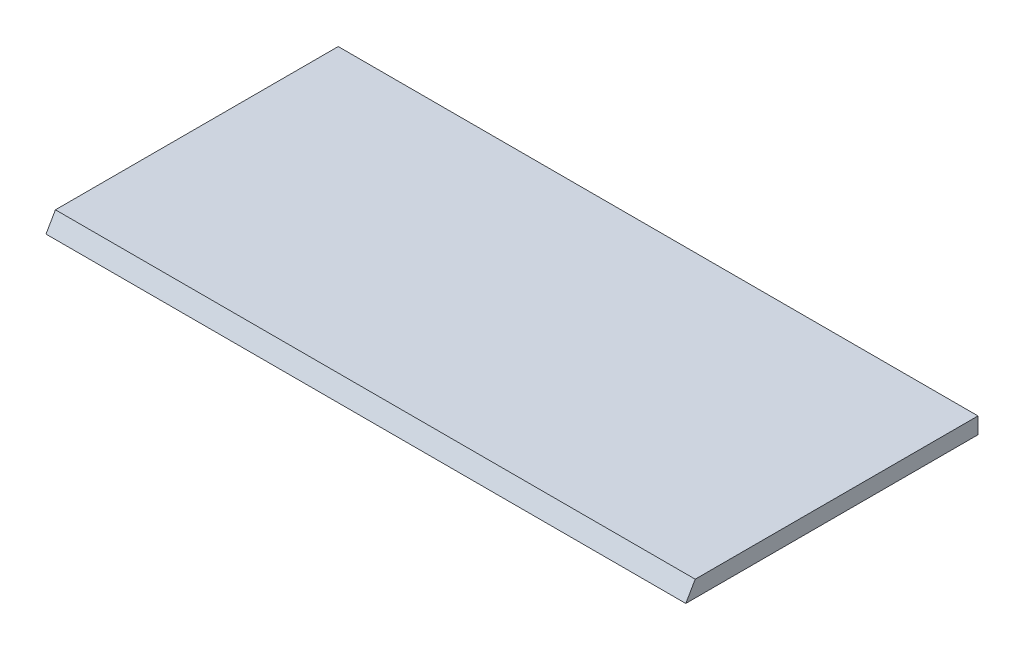
ISO-10303-21;
HEADER;
FILE_DESCRIPTION(('STEP AP214'),'2;1');
FILE_NAME('part.step','',(''),(''),'','','');
FILE_SCHEMA(('AUTOMOTIVE_DESIGN { 1 0 10303 214 1 1 1 1 }'));
ENDSEC;
DATA;
#1=APPLICATION_CONTEXT('core data for automotive mechanical design processes');
#2=APPLICATION_PROTOCOL_DEFINITION('international standard','automotive_design',2000,#1);
#3=PRODUCT_CONTEXT('',#1,'mechanical');
#4=PRODUCT('Part','Part','',(#3));
#5=PRODUCT_RELATED_PRODUCT_CATEGORY('part','',(#4));
#6=PRODUCT_DEFINITION_FORMATION('','',#4);
#7=PRODUCT_DEFINITION_CONTEXT('part definition',#1,'design');
#8=PRODUCT_DEFINITION('design','',#6,#7);
#9=PRODUCT_DEFINITION_SHAPE('','',#8);
#10=(LENGTH_UNIT() NAMED_UNIT(*) SI_UNIT(.MILLI.,.METRE.));
#11=(NAMED_UNIT(*) PLANE_ANGLE_UNIT() SI_UNIT($,.RADIAN.));
#12=(NAMED_UNIT(*) SI_UNIT($,.STERADIAN.) SOLID_ANGLE_UNIT());
#13=UNCERTAINTY_MEASURE_WITH_UNIT(LENGTH_MEASURE(1.E-05),#10,'distance_accuracy_value','');
#14=(GEOMETRIC_REPRESENTATION_CONTEXT(3) GLOBAL_UNCERTAINTY_ASSIGNED_CONTEXT((#13)) GLOBAL_UNIT_ASSIGNED_CONTEXT((#10,
#11,#12)) REPRESENTATION_CONTEXT('',''));
#15=CARTESIAN_POINT('',(0.,0.,0.));
#16=DIRECTION('',(0.,0.,1.));
#17=DIRECTION('',(1.,0.,0.));
#18=AXIS2_PLACEMENT_3D('',#15,#16,#17);
#19=CARTESIAN_POINT('',(196.,0.,0.));
#20=DIRECTION('',(0.,1.,0.));
#21=DIRECTION('',(0.,0.,1.));
#22=AXIS2_PLACEMENT_3D('',#19,#20,#21);
#23=PLANE('',#22);
#24=DIRECTION('',(0.,0.,-1.));
#25=VECTOR('',#24,1.);
#26=CARTESIAN_POINT('',(0.,0.,0.));
#27=LINE('',#26,#25);
#28=CARTESIAN_POINT('',(0.,0.,0.));
#29=VERTEX_POINT('',#28);
#30=CARTESIAN_POINT('',(0.,0.,-89.52));
#31=VERTEX_POINT('',#30);
#32=EDGE_CURVE('E162',#29,#31,#27,.T.);
#33=ORIENTED_EDGE('',*,*,#32,.T.);
#34=DIRECTION('',(-1.,0.,0.));
#35=VECTOR('',#34,1.);
#36=CARTESIAN_POINT('',(196.,0.,-89.52));
#37=LINE('',#36,#35);
#38=CARTESIAN_POINT('',(196.,0.,-89.52));
#39=VERTEX_POINT('',#38);
#40=EDGE_CURVE('E47',#39,#31,#37,.T.);
#41=ORIENTED_EDGE('',*,*,#40,.F.);
#42=DIRECTION('',(0.,0.,-1.));
#43=VECTOR('',#42,1.);
#44=CARTESIAN_POINT('',(196.,0.,0.));
#45=LINE('',#44,#43);
#46=CARTESIAN_POINT('',(196.,0.,0.));
#47=VERTEX_POINT('',#46);
#48=EDGE_CURVE('E91',#47,#39,#45,.T.);
#49=ORIENTED_EDGE('',*,*,#48,.F.);
#50=DIRECTION('',(-1.,0.,0.));
#51=VECTOR('',#50,1.);
#52=CARTESIAN_POINT('',(196.,0.,0.));
#53=LINE('',#52,#51);
#54=EDGE_CURVE('E11',#47,#29,#53,.T.);
#55=ORIENTED_EDGE('',*,*,#54,.T.);
#56=EDGE_LOOP('',(#33,#41,#49,#55));
#57=FACE_BOUND('',#56,.T.);
#58=DIRECTION('',(0.,0.,-1.));
#59=VECTOR('',#58,1.);
#60=CARTESIAN_POINT('',(4.,0.,0.));
#61=LINE('',#60,#59);
#62=CARTESIAN_POINT('',(4.,0.,-4.618802153517));
#63=VERTEX_POINT('',#62);
#64=CARTESIAN_POINT('',(4.,0.,-85.52));
#65=VERTEX_POINT('',#64);
#66=EDGE_CURVE('E135',#63,#65,#61,.T.);
#67=ORIENTED_EDGE('',*,*,#66,.F.);
#68=DIRECTION('',(-1.,0.,0.));
#69=VECTOR('',#68,1.);
#70=CARTESIAN_POINT('',(196.,0.,-4.618802153517));
#71=LINE('',#70,#69);
#72=CARTESIAN_POINT('',(192.,0.,-4.618802153517));
#73=VERTEX_POINT('',#72);
#74=EDGE_CURVE('E134',#73,#63,#71,.T.);
#75=ORIENTED_EDGE('',*,*,#74,.F.);
#76=DIRECTION('',(0.,0.,-1.));
#77=VECTOR('',#76,1.);
#78=CARTESIAN_POINT('',(192.,0.,0.));
#79=LINE('',#78,#77);
#80=CARTESIAN_POINT('',(192.,0.,-85.52));
#81=VERTEX_POINT('',#80);
#82=EDGE_CURVE('E139',#73,#81,#79,.T.);
#83=ORIENTED_EDGE('',*,*,#82,.T.);
#84=DIRECTION('',(-1.,0.,0.));
#85=VECTOR('',#84,1.);
#86=CARTESIAN_POINT('',(196.,0.,-85.52));
#87=LINE('',#86,#85);
#88=EDGE_CURVE('E144',#81,#65,#87,.T.);
#89=ORIENTED_EDGE('',*,*,#88,.T.);
#90=EDGE_LOOP('',(#67,#75,#83,#89));
#91=FACE_BOUND('',#90,.T.);
#92=ADVANCED_FACE('F39',(#57,#91),#23,.F.);
#93=CARTESIAN_POINT('',(196.,0.,0.));
#94=DIRECTION('',(0.,-0.499999999999997,-0.866025403784441));
#95=DIRECTION('',(0.,0.866025403784441,-0.499999999999997));
#96=AXIS2_PLACEMENT_3D('',#93,#94,#95);
#97=PLANE('',#96);
#98=DIRECTION('',(0.,-0.86602540378444,0.499999999999997));
#99=VECTOR('',#98,1.);
#100=CARTESIAN_POINT('',(0.,0.,0.));
#101=LINE('',#100,#99);
#102=CARTESIAN_POINT('',(0.,4.99999999999999,-2.8867513459481));
#103=VERTEX_POINT('',#102);
#104=EDGE_CURVE('E147',#103,#29,#101,.T.);
#105=ORIENTED_EDGE('',*,*,#104,.T.);
#106=ORIENTED_EDGE('',*,*,#54,.F.);
#107=DIRECTION('',(0.,-0.86602540378444,0.499999999999997));
#108=VECTOR('',#107,1.);
#109=CARTESIAN_POINT('',(196.,0.,0.));
#110=LINE('',#109,#108);
#111=CARTESIAN_POINT('',(196.,4.99999999999999,-2.8867513459481));
#112=VERTEX_POINT('',#111);
#113=EDGE_CURVE('E153',#112,#47,#110,.T.);
#114=ORIENTED_EDGE('',*,*,#113,.F.);
#115=DIRECTION('',(-1.,0.,0.));
#116=VECTOR('',#115,1.);
#117=CARTESIAN_POINT('',(196.,4.99999999999999,-2.8867513459481));
#118=LINE('',#117,#116);
#119=EDGE_CURVE('E159',#112,#103,#118,.T.);
#120=ORIENTED_EDGE('',*,*,#119,.T.);
#121=EDGE_LOOP('',(#105,#106,#114,#120));
#122=FACE_BOUND('',#121,.T.);
#123=ADVANCED_FACE('F41',(#122),#97,.F.);
#124=CARTESIAN_POINT('',(196.,0.,-89.52));
#125=DIRECTION('',(0.,0.,1.));
#126=DIRECTION('',(1.,0.,0.));
#127=AXIS2_PLACEMENT_3D('',#124,#125,#126);
#128=PLANE('',#127);
#129=DIRECTION('',(0.,1.,0.));
#130=VECTOR('',#129,1.);
#131=CARTESIAN_POINT('',(0.,0.,-89.52));
#132=LINE('',#131,#130);
#133=CARTESIAN_POINT('',(0.,5.,-89.52));
#134=VERTEX_POINT('',#133);
#135=EDGE_CURVE('E164',#31,#134,#132,.T.);
#136=ORIENTED_EDGE('',*,*,#135,.T.);
#137=DIRECTION('',(-1.,0.,0.));
#138=VECTOR('',#137,1.);
#139=CARTESIAN_POINT('',(196.,5.,-89.52));
#140=LINE('',#139,#138);
#141=CARTESIAN_POINT('',(196.,5.,-89.52));
#142=VERTEX_POINT('',#141);
#143=EDGE_CURVE('E168',#142,#134,#140,.T.);
#144=ORIENTED_EDGE('',*,*,#143,.F.);
#145=DIRECTION('',(0.,1.,0.));
#146=VECTOR('',#145,1.);
#147=CARTESIAN_POINT('',(196.,0.,-89.52));
#148=LINE('',#147,#146);
#149=EDGE_CURVE('E156',#39,#142,#148,.T.);
#150=ORIENTED_EDGE('',*,*,#149,.F.);
#151=ORIENTED_EDGE('',*,*,#40,.T.);
#152=EDGE_LOOP('',(#136,#144,#150,#151));
#153=FACE_BOUND('',#152,.T.);
#154=ADVANCED_FACE('F173',(#153),#128,.F.);
#155=CARTESIAN_POINT('',(196.,5.,-89.52));
#156=DIRECTION('',(0.,-1.,0.));
#157=DIRECTION('',(0.,0.,-1.));
#158=AXIS2_PLACEMENT_3D('',#155,#156,#157);
#159=PLANE('',#158);
#160=DIRECTION('',(0.,0.,1.));
#161=VECTOR('',#160,1.);
#162=CARTESIAN_POINT('',(0.,5.,-89.52));
#163=LINE('',#162,#161);
#164=EDGE_CURVE('E84',#134,#103,#163,.T.);
#165=ORIENTED_EDGE('',*,*,#164,.T.);
#166=ORIENTED_EDGE('',*,*,#119,.F.);
#167=DIRECTION('',(0.,0.,1.));
#168=VECTOR('',#167,1.);
#169=CARTESIAN_POINT('',(196.,5.,-89.52));
#170=LINE('',#169,#168);
#171=EDGE_CURVE('E63',#142,#112,#170,.T.);
#172=ORIENTED_EDGE('',*,*,#171,.F.);
#173=ORIENTED_EDGE('',*,*,#143,.T.);
#174=EDGE_LOOP('',(#165,#166,#172,#173));
#175=FACE_BOUND('',#174,.T.);
#176=ADVANCED_FACE('F181',(#175),#159,.F.);
#177=CARTESIAN_POINT('',(196.,0.,0.));
#178=DIRECTION('',(1.,0.,0.));
#179=DIRECTION('',(0.,0.,-1.));
#180=AXIS2_PLACEMENT_3D('',#177,#178,#179);
#181=PLANE('',#180);
#182=ORIENTED_EDGE('',*,*,#113,.T.);
#183=ORIENTED_EDGE('',*,*,#48,.T.);
#184=ORIENTED_EDGE('',*,*,#149,.T.);
#185=ORIENTED_EDGE('',*,*,#171,.T.);
#186=EDGE_LOOP('',(#182,#183,#184,#185));
#187=FACE_BOUND('',#186,.T.);
#188=ADVANCED_FACE('F183',(#187),#181,.T.);
#189=CARTESIAN_POINT('',(0.,0.,0.));
#190=DIRECTION('',(1.,0.,0.));
#191=DIRECTION('',(0.,0.,-1.));
#192=AXIS2_PLACEMENT_3D('',#189,#190,#191);
#193=PLANE('',#192);
#194=ORIENTED_EDGE('',*,*,#104,.F.);
#195=ORIENTED_EDGE('',*,*,#164,.F.);
#196=ORIENTED_EDGE('',*,*,#135,.F.);
#197=ORIENTED_EDGE('',*,*,#32,.F.);
#198=EDGE_LOOP('',(#194,#195,#196,#197));
#199=FACE_BOUND('',#198,.T.);
#200=ADVANCED_FACE('F177',(#199),#193,.F.);
#201=CARTESIAN_POINT('',(196.,-1.99999999999999,-3.46410161513776));
#202=DIRECTION('',(0.,-0.499999999999997,-0.866025403784441));
#203=DIRECTION('',(0.,0.866025403784441,-0.499999999999997));
#204=AXIS2_PLACEMENT_3D('',#201,#202,#203);
#205=PLANE('',#204);
#206=DIRECTION('',(0.,-0.866025403784441,0.499999999999997));
#207=VECTOR('',#206,1.);
#208=CARTESIAN_POINT('',(4.,-1.99999999999999,-3.46410161513776));
#209=LINE('',#208,#207);
#210=CARTESIAN_POINT('',(4.,0.99999999999999,-5.19615242270661));
#211=VERTEX_POINT('',#210);
#212=EDGE_CURVE('E118',#211,#63,#209,.T.);
#213=ORIENTED_EDGE('',*,*,#212,.F.);
#214=DIRECTION('',(-1.,0.,0.));
#215=VECTOR('',#214,1.);
#216=CARTESIAN_POINT('',(196.,0.99999999999999,-5.19615242270661));
#217=LINE('',#216,#215);
#218=CARTESIAN_POINT('',(192.,0.99999999999999,-5.19615242270661));
#219=VERTEX_POINT('',#218);
#220=EDGE_CURVE('E126',#219,#211,#217,.T.);
#221=ORIENTED_EDGE('',*,*,#220,.F.);
#222=DIRECTION('',(0.,-0.866025403784441,0.499999999999997));
#223=VECTOR('',#222,1.);
#224=CARTESIAN_POINT('',(192.,-1.99999999999999,-3.46410161513776));
#225=LINE('',#224,#223);
#226=EDGE_CURVE('E54',#219,#73,#225,.T.);
#227=ORIENTED_EDGE('',*,*,#226,.T.);
#228=ORIENTED_EDGE('',*,*,#74,.T.);
#229=EDGE_LOOP('',(#213,#221,#227,#228));
#230=FACE_BOUND('',#229,.T.);
#231=ADVANCED_FACE('F132',(#230),#205,.T.);
#232=CARTESIAN_POINT('',(196.,0.,-85.52));
#233=DIRECTION('',(0.,0.,1.));
#234=DIRECTION('',(1.,0.,0.));
#235=AXIS2_PLACEMENT_3D('',#232,#233,#234);
#236=PLANE('',#235);
#237=DIRECTION('',(0.,1.,0.));
#238=VECTOR('',#237,1.);
#239=CARTESIAN_POINT('',(4.,0.,-85.52));
#240=LINE('',#239,#238);
#241=CARTESIAN_POINT('',(4.,1.,-85.52));
#242=VERTEX_POINT('',#241);
#243=EDGE_CURVE('E121',#65,#242,#240,.T.);
#244=ORIENTED_EDGE('',*,*,#243,.F.);
#245=ORIENTED_EDGE('',*,*,#88,.F.);
#246=DIRECTION('',(0.,1.,0.));
#247=VECTOR('',#246,1.);
#248=CARTESIAN_POINT('',(192.,0.,-85.52));
#249=LINE('',#248,#247);
#250=CARTESIAN_POINT('',(192.,1.,-85.52));
#251=VERTEX_POINT('',#250);
#252=EDGE_CURVE('E142',#81,#251,#249,.T.);
#253=ORIENTED_EDGE('',*,*,#252,.T.);
#254=DIRECTION('',(-1.,0.,0.));
#255=VECTOR('',#254,1.);
#256=CARTESIAN_POINT('',(196.,1.,-85.52));
#257=LINE('',#256,#255);
#258=EDGE_CURVE('E130',#251,#242,#257,.T.);
#259=ORIENTED_EDGE('',*,*,#258,.T.);
#260=EDGE_LOOP('',(#244,#245,#253,#259));
#261=FACE_BOUND('',#260,.T.);
#262=ADVANCED_FACE('F198',(#261),#236,.T.);
#263=CARTESIAN_POINT('',(196.,1.,-89.52));
#264=DIRECTION('',(0.,-1.,0.));
#265=DIRECTION('',(0.,0.,-1.));
#266=AXIS2_PLACEMENT_3D('',#263,#264,#265);
#267=PLANE('',#266);
#268=DIRECTION('',(0.,0.,1.));
#269=VECTOR('',#268,1.);
#270=CARTESIAN_POINT('',(4.,1.,-89.52));
#271=LINE('',#270,#269);
#272=EDGE_CURVE('E114',#242,#211,#271,.T.);
#273=ORIENTED_EDGE('',*,*,#272,.F.);
#274=ORIENTED_EDGE('',*,*,#258,.F.);
#275=DIRECTION('',(0.,0.,1.));
#276=VECTOR('',#275,1.);
#277=CARTESIAN_POINT('',(192.,1.,-89.52));
#278=LINE('',#277,#276);
#279=EDGE_CURVE('E129',#251,#219,#278,.T.);
#280=ORIENTED_EDGE('',*,*,#279,.T.);
#281=ORIENTED_EDGE('',*,*,#220,.T.);
#282=EDGE_LOOP('',(#273,#274,#280,#281));
#283=FACE_BOUND('',#282,.T.);
#284=ADVANCED_FACE('F127',(#283),#267,.T.);
#285=CARTESIAN_POINT('',(192.,0.,0.));
#286=DIRECTION('',(1.,0.,0.));
#287=DIRECTION('',(0.,0.,-1.));
#288=AXIS2_PLACEMENT_3D('',#285,#286,#287);
#289=PLANE('',#288);
#290=ORIENTED_EDGE('',*,*,#226,.F.);
#291=ORIENTED_EDGE('',*,*,#279,.F.);
#292=ORIENTED_EDGE('',*,*,#252,.F.);
#293=ORIENTED_EDGE('',*,*,#82,.F.);
#294=EDGE_LOOP('',(#290,#291,#292,#293));
#295=FACE_BOUND('',#294,.T.);
#296=ADVANCED_FACE('F201',(#295),#289,.F.);
#297=CARTESIAN_POINT('',(4.,0.,0.));
#298=DIRECTION('',(1.,0.,0.));
#299=DIRECTION('',(0.,0.,-1.));
#300=AXIS2_PLACEMENT_3D('',#297,#298,#299);
#301=PLANE('',#300);
#302=ORIENTED_EDGE('',*,*,#212,.T.);
#303=ORIENTED_EDGE('',*,*,#66,.T.);
#304=ORIENTED_EDGE('',*,*,#243,.T.);
#305=ORIENTED_EDGE('',*,*,#272,.T.);
#306=EDGE_LOOP('',(#302,#303,#304,#305));
#307=FACE_BOUND('',#306,.T.);
#308=ADVANCED_FACE('F116',(#307),#301,.T.);
#309=CLOSED_SHELL('',(#92,#123,#154,#176,#188,#200,#231,#262,#284,#296,#308));
#310=MANIFOLD_SOLID_BREP('B2',#309);
#311=ADVANCED_BREP_SHAPE_REPRESENTATION('',(#18,#310),#14);
#312=SHAPE_DEFINITION_REPRESENTATION(#9,#311);
ENDSEC;
END-ISO-10303-21;
